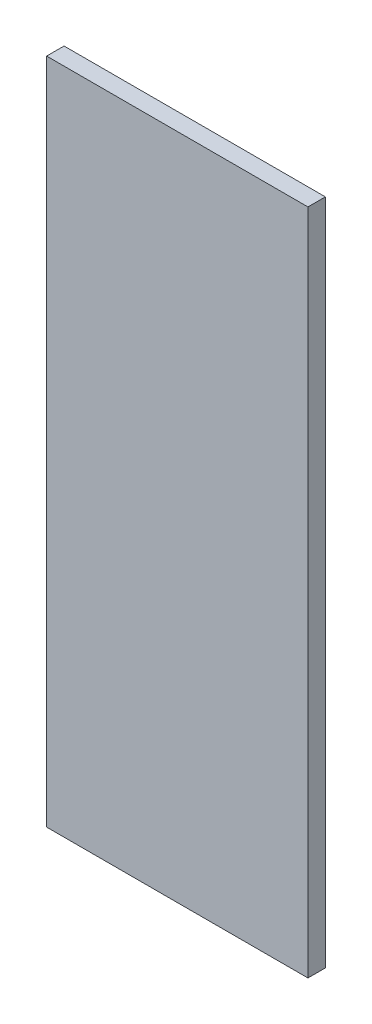
ISO-10303-21;
HEADER;
FILE_DESCRIPTION(('STEP AP214'),'2;1');
FILE_NAME('part.step','',(''),(''),'','','');
FILE_SCHEMA(('AUTOMOTIVE_DESIGN { 1 0 10303 214 1 1 1 1 }'));
ENDSEC;
DATA;
#1=APPLICATION_CONTEXT('core data for automotive mechanical design processes');
#2=APPLICATION_PROTOCOL_DEFINITION('international standard','automotive_design',2000,#1);
#3=PRODUCT_CONTEXT('',#1,'mechanical');
#4=PRODUCT('Part','Part','',(#3));
#5=PRODUCT_RELATED_PRODUCT_CATEGORY('part','',(#4));
#6=PRODUCT_DEFINITION_FORMATION('','',#4);
#7=PRODUCT_DEFINITION_CONTEXT('part definition',#1,'design');
#8=PRODUCT_DEFINITION('design','',#6,#7);
#9=PRODUCT_DEFINITION_SHAPE('','',#8);
#10=(LENGTH_UNIT() NAMED_UNIT(*) SI_UNIT(.MILLI.,.METRE.));
#11=(NAMED_UNIT(*) PLANE_ANGLE_UNIT() SI_UNIT($,.RADIAN.));
#12=(NAMED_UNIT(*) SI_UNIT($,.STERADIAN.) SOLID_ANGLE_UNIT());
#13=UNCERTAINTY_MEASURE_WITH_UNIT(LENGTH_MEASURE(1.E-05),#10,'distance_accuracy_value','');
#14=(GEOMETRIC_REPRESENTATION_CONTEXT(3) GLOBAL_UNCERTAINTY_ASSIGNED_CONTEXT((#13)) GLOBAL_UNIT_ASSIGNED_CONTEXT((#10,
#11,#12)) REPRESENTATION_CONTEXT('',''));
#15=CARTESIAN_POINT('',(0.,0.,0.));
#16=DIRECTION('',(0.,0.,1.));
#17=DIRECTION('',(1.,0.,0.));
#18=AXIS2_PLACEMENT_3D('',#15,#16,#17);
#19=CARTESIAN_POINT('',(0.,0.,6.));
#20=DIRECTION('',(1.,0.,0.));
#21=DIRECTION('',(0.,0.,-1.));
#22=AXIS2_PLACEMENT_3D('',#19,#20,#21);
#23=PLANE('',#22);
#24=DIRECTION('',(0.,-1.,0.));
#25=VECTOR('',#24,1.);
#26=CARTESIAN_POINT('',(0.,0.,0.));
#27=LINE('',#26,#25);
#28=CARTESIAN_POINT('',(0.,230.,0.));
#29=VERTEX_POINT('',#28);
#30=CARTESIAN_POINT('',(0.,0.,0.));
#31=VERTEX_POINT('',#30);
#32=EDGE_CURVE('E97',#29,#31,#27,.T.);
#33=ORIENTED_EDGE('',*,*,#32,.T.);
#34=DIRECTION('',(0.,0.,-1.));
#35=VECTOR('',#34,1.);
#36=CARTESIAN_POINT('',(0.,0.,6.));
#37=LINE('',#36,#35);
#38=CARTESIAN_POINT('',(0.,0.,6.));
#39=VERTEX_POINT('',#38);
#40=EDGE_CURVE('E11',#39,#31,#37,.T.);
#41=ORIENTED_EDGE('',*,*,#40,.F.);
#42=DIRECTION('',(0.,-1.,0.));
#43=VECTOR('',#42,1.);
#44=CARTESIAN_POINT('',(0.,0.,6.));
#45=LINE('',#44,#43);
#46=CARTESIAN_POINT('',(0.,230.,6.));
#47=VERTEX_POINT('',#46);
#48=EDGE_CURVE('E85',#47,#39,#45,.T.);
#49=ORIENTED_EDGE('',*,*,#48,.F.);
#50=DIRECTION('',(0.,0.,-1.));
#51=VECTOR('',#50,1.);
#52=CARTESIAN_POINT('',(0.,230.,6.));
#53=LINE('',#52,#51);
#54=EDGE_CURVE('E93',#47,#29,#53,.T.);
#55=ORIENTED_EDGE('',*,*,#54,.T.);
#56=EDGE_LOOP('',(#33,#41,#49,#55));
#57=FACE_BOUND('',#56,.T.);
#58=ADVANCED_FACE('F34',(#57),#23,.F.);
#59=CARTESIAN_POINT('',(0.,0.,6.));
#60=DIRECTION('',(0.,1.,0.));
#61=DIRECTION('',(0.,0.,1.));
#62=AXIS2_PLACEMENT_3D('',#59,#60,#61);
#63=PLANE('',#62);
#64=DIRECTION('',(1.,0.,0.));
#65=VECTOR('',#64,1.);
#66=CARTESIAN_POINT('',(0.,0.,0.));
#67=LINE('',#66,#65);
#68=CARTESIAN_POINT('',(90.,0.,0.));
#69=VERTEX_POINT('',#68);
#70=EDGE_CURVE('E89',#31,#69,#67,.T.);
#71=ORIENTED_EDGE('',*,*,#70,.T.);
#72=DIRECTION('',(0.,0.,-1.));
#73=VECTOR('',#72,1.);
#74=CARTESIAN_POINT('',(90.,0.,6.));
#75=LINE('',#74,#73);
#76=CARTESIAN_POINT('',(90.,0.,6.));
#77=VERTEX_POINT('',#76);
#78=EDGE_CURVE('E42',#77,#69,#75,.T.);
#79=ORIENTED_EDGE('',*,*,#78,.F.);
#80=DIRECTION('',(1.,0.,0.));
#81=VECTOR('',#80,1.);
#82=CARTESIAN_POINT('',(0.,0.,6.));
#83=LINE('',#82,#81);
#84=EDGE_CURVE('E80',#39,#77,#83,.T.);
#85=ORIENTED_EDGE('',*,*,#84,.F.);
#86=ORIENTED_EDGE('',*,*,#40,.T.);
#87=EDGE_LOOP('',(#71,#79,#85,#86));
#88=FACE_BOUND('',#87,.T.);
#89=ADVANCED_FACE('F88',(#88),#63,.F.);
#90=CARTESIAN_POINT('',(90.,0.,6.));
#91=DIRECTION('',(-1.,0.,0.));
#92=DIRECTION('',(0.,0.,1.));
#93=AXIS2_PLACEMENT_3D('',#90,#91,#92);
#94=PLANE('',#93);
#95=DIRECTION('',(0.,1.,0.));
#96=VECTOR('',#95,1.);
#97=CARTESIAN_POINT('',(90.,0.,0.));
#98=LINE('',#97,#96);
#99=CARTESIAN_POINT('',(90.,230.,0.));
#100=VERTEX_POINT('',#99);
#101=EDGE_CURVE('E67',#69,#100,#98,.T.);
#102=ORIENTED_EDGE('',*,*,#101,.T.);
#103=DIRECTION('',(0.,0.,-1.));
#104=VECTOR('',#103,1.);
#105=CARTESIAN_POINT('',(90.,230.,6.));
#106=LINE('',#105,#104);
#107=CARTESIAN_POINT('',(90.,230.,6.));
#108=VERTEX_POINT('',#107);
#109=EDGE_CURVE('E90',#108,#100,#106,.T.);
#110=ORIENTED_EDGE('',*,*,#109,.F.);
#111=DIRECTION('',(0.,1.,0.));
#112=VECTOR('',#111,1.);
#113=CARTESIAN_POINT('',(90.,0.,6.));
#114=LINE('',#113,#112);
#115=EDGE_CURVE('E83',#77,#108,#114,.T.);
#116=ORIENTED_EDGE('',*,*,#115,.F.);
#117=ORIENTED_EDGE('',*,*,#78,.T.);
#118=EDGE_LOOP('',(#102,#110,#116,#117));
#119=FACE_BOUND('',#118,.T.);
#120=ADVANCED_FACE('F91',(#119),#94,.F.);
#121=CARTESIAN_POINT('',(0.,230.,6.));
#122=DIRECTION('',(0.,-1.,0.));
#123=DIRECTION('',(0.,0.,-1.));
#124=AXIS2_PLACEMENT_3D('',#121,#122,#123);
#125=PLANE('',#124);
#126=DIRECTION('',(-1.,0.,0.));
#127=VECTOR('',#126,1.);
#128=CARTESIAN_POINT('',(0.,230.,0.));
#129=LINE('',#128,#127);
#130=EDGE_CURVE('E73',#100,#29,#129,.T.);
#131=ORIENTED_EDGE('',*,*,#130,.T.);
#132=ORIENTED_EDGE('',*,*,#54,.F.);
#133=DIRECTION('',(-1.,0.,0.));
#134=VECTOR('',#133,1.);
#135=CARTESIAN_POINT('',(0.,230.,6.));
#136=LINE('',#135,#134);
#137=EDGE_CURVE('E50',#108,#47,#136,.T.);
#138=ORIENTED_EDGE('',*,*,#137,.F.);
#139=ORIENTED_EDGE('',*,*,#109,.T.);
#140=EDGE_LOOP('',(#131,#132,#138,#139));
#141=FACE_BOUND('',#140,.T.);
#142=ADVANCED_FACE('F104',(#141),#125,.F.);
#143=CARTESIAN_POINT('',(0.,0.,6.));
#144=DIRECTION('',(0.,0.,-1.));
#145=DIRECTION('',(-1.,0.,0.));
#146=AXIS2_PLACEMENT_3D('',#143,#144,#145);
#147=PLANE('',#146);
#148=ORIENTED_EDGE('',*,*,#48,.T.);
#149=ORIENTED_EDGE('',*,*,#84,.T.);
#150=ORIENTED_EDGE('',*,*,#115,.T.);
#151=ORIENTED_EDGE('',*,*,#137,.T.);
#152=EDGE_LOOP('',(#148,#149,#150,#151));
#153=FACE_BOUND('',#152,.T.);
#154=ADVANCED_FACE('F81',(#153),#147,.F.);
#155=CARTESIAN_POINT('',(0.,0.,0.));
#156=DIRECTION('',(0.,0.,-1.));
#157=DIRECTION('',(-1.,0.,0.));
#158=AXIS2_PLACEMENT_3D('',#155,#156,#157);
#159=PLANE('',#158);
#160=ORIENTED_EDGE('',*,*,#32,.F.);
#161=ORIENTED_EDGE('',*,*,#130,.F.);
#162=ORIENTED_EDGE('',*,*,#101,.F.);
#163=ORIENTED_EDGE('',*,*,#70,.F.);
#164=EDGE_LOOP('',(#160,#161,#162,#163));
#165=FACE_BOUND('',#164,.T.);
#166=ADVANCED_FACE('F107',(#165),#159,.T.);
#167=CLOSED_SHELL('',(#58,#89,#120,#142,#154,#166));
#168=MANIFOLD_SOLID_BREP('B2',#167);
#169=ADVANCED_BREP_SHAPE_REPRESENTATION('',(#18,#168),#14);
#170=SHAPE_DEFINITION_REPRESENTATION(#9,#169);
ENDSEC;
END-ISO-10303-21;
